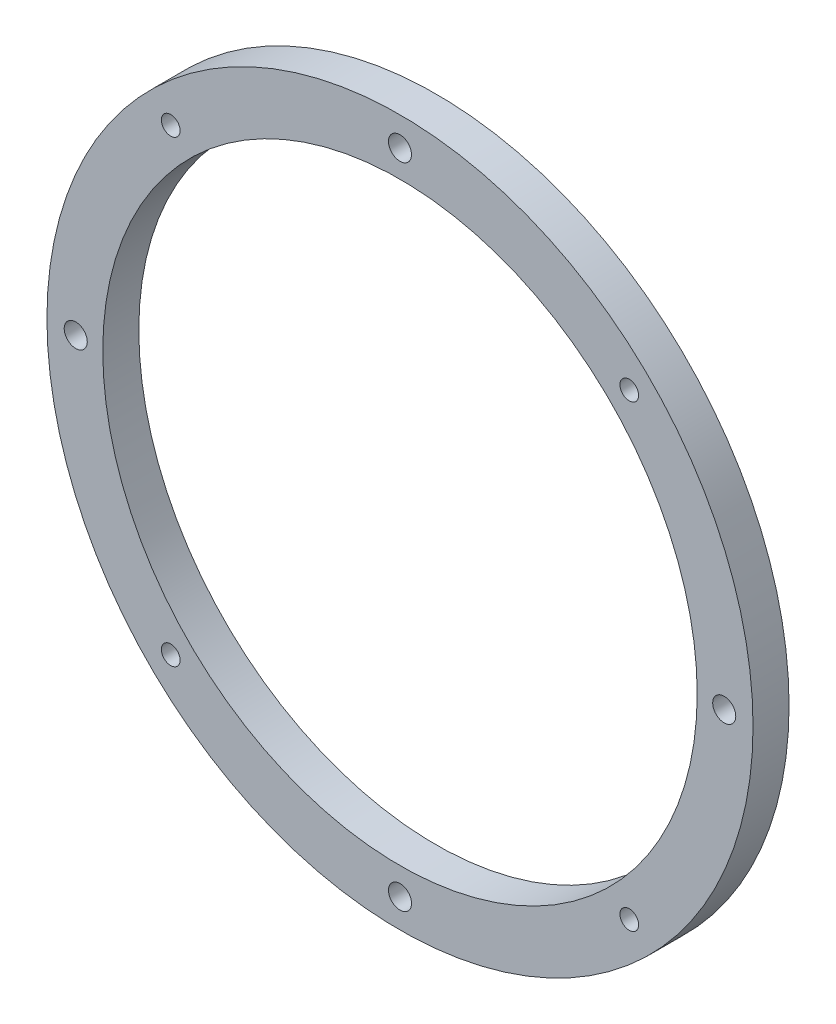
ISO-10303-21;
HEADER;
FILE_DESCRIPTION(('STEP AP214'),'2;1');
FILE_NAME('part.step','',(''),(''),'','','');
FILE_SCHEMA(('AUTOMOTIVE_DESIGN { 1 0 10303 214 1 1 1 1 }'));
ENDSEC;
DATA;
#1=APPLICATION_CONTEXT('core data for automotive mechanical design processes');
#2=APPLICATION_PROTOCOL_DEFINITION('international standard','automotive_design',2000,#1);
#3=PRODUCT_CONTEXT('',#1,'mechanical');
#4=PRODUCT('Part','Part','',(#3));
#5=PRODUCT_RELATED_PRODUCT_CATEGORY('part','',(#4));
#6=PRODUCT_DEFINITION_FORMATION('','',#4);
#7=PRODUCT_DEFINITION_CONTEXT('part definition',#1,'design');
#8=PRODUCT_DEFINITION('design','',#6,#7);
#9=PRODUCT_DEFINITION_SHAPE('','',#8);
#10=(LENGTH_UNIT() NAMED_UNIT(*) SI_UNIT(.MILLI.,.METRE.));
#11=(NAMED_UNIT(*) PLANE_ANGLE_UNIT() SI_UNIT($,.RADIAN.));
#12=(NAMED_UNIT(*) SI_UNIT($,.STERADIAN.) SOLID_ANGLE_UNIT());
#13=UNCERTAINTY_MEASURE_WITH_UNIT(LENGTH_MEASURE(1.E-05),#10,'distance_accuracy_value','');
#14=(GEOMETRIC_REPRESENTATION_CONTEXT(3) GLOBAL_UNCERTAINTY_ASSIGNED_CONTEXT((#13)) GLOBAL_UNIT_ASSIGNED_CONTEXT((#10,
#11,#12)) REPRESENTATION_CONTEXT('',''));
#15=CARTESIAN_POINT('',(0.,0.,0.));
#16=DIRECTION('',(0.,0.,1.));
#17=DIRECTION('',(1.,0.,0.));
#18=AXIS2_PLACEMENT_3D('',#15,#16,#17);
#19=CARTESIAN_POINT('',(0.,0.,127.));
#20=DIRECTION('',(0.,0.,1.));
#21=DIRECTION('',(1.,0.,0.));
#22=AXIS2_PLACEMENT_3D('',#19,#20,#21);
#23=PLANE('',#22);
#24=CARTESIAN_POINT('',(-1143.,-5.08348353050441E-13,127.));
#25=DIRECTION('',(0.,0.,1.));
#26=DIRECTION('',(1.,0.,0.));
#27=AXIS2_PLACEMENT_3D('',#24,#25,#26);
#28=CIRCLE('',#27,40.6400000000121);
#29=CARTESIAN_POINT('',(-1102.35999999999,-5.08348353050441E-13,127.));
#30=VERTEX_POINT('',#29);
#31=EDGE_CURVE('E98',#30,#30,#28,.T.);
#32=ORIENTED_EDGE('',*,*,#31,.F.);
#33=EDGE_LOOP('',(#32));
#34=FACE_BOUND('',#33,.T.);
#35=CARTESIAN_POINT('',(1.29665096438356E-12,-1143.,127.));
#36=DIRECTION('',(0.,0.,1.));
#37=DIRECTION('',(1.,0.,0.));
#38=AXIS2_PLACEMENT_3D('',#35,#36,#37);
#39=CIRCLE('',#38,40.6400000000089);
#40=CARTESIAN_POINT('',(40.6400000000102,-1143.,127.));
#41=VERTEX_POINT('',#40);
#42=EDGE_CURVE('E86',#41,#41,#39,.T.);
#43=ORIENTED_EDGE('',*,*,#42,.F.);
#44=EDGE_LOOP('',(#43));
#45=FACE_BOUND('',#44,.T.);
#46=CARTESIAN_POINT('',(1143.,6.4832548219056E-13,127.));
#47=DIRECTION('',(0.,0.,1.));
#48=DIRECTION('',(1.,0.,0.));
#49=AXIS2_PLACEMENT_3D('',#46,#47,#48);
#50=CIRCLE('',#49,40.6400000000042);
#51=CARTESIAN_POINT('',(1183.64,6.4832548219056E-13,127.));
#52=VERTEX_POINT('',#51);
#53=EDGE_CURVE('E74',#52,#52,#50,.T.);
#54=ORIENTED_EDGE('',*,*,#53,.F.);
#55=EDGE_LOOP('',(#54));
#56=FACE_BOUND('',#55,.T.);
#57=CARTESIAN_POINT('',(0.,1143.,127.));
#58=DIRECTION('',(0.,0.,1.));
#59=DIRECTION('',(1.,0.,0.));
#60=AXIS2_PLACEMENT_3D('',#57,#58,#59);
#61=CIRCLE('',#60,40.64);
#62=CARTESIAN_POINT('',(40.64,1143.,127.));
#63=VERTEX_POINT('',#62);
#64=EDGE_CURVE('E62',#63,#63,#61,.T.);
#65=ORIENTED_EDGE('',*,*,#64,.F.);
#66=EDGE_LOOP('',(#65));
#67=FACE_BOUND('',#66,.T.);
#68=CARTESIAN_POINT('',(0.,0.,127.));
#69=DIRECTION('',(0.,0.,1.));
#70=DIRECTION('',(1.,0.,0.));
#71=AXIS2_PLACEMENT_3D('',#68,#69,#70);
#72=CIRCLE('',#71,1244.6);
#73=CARTESIAN_POINT('',(1244.6,0.,127.));
#74=VERTEX_POINT('',#73);
#75=EDGE_CURVE('E10',#74,#74,#72,.T.);
#76=ORIENTED_EDGE('',*,*,#75,.T.);
#77=EDGE_LOOP('',(#76));
#78=FACE_BOUND('',#77,.T.);
#79=CARTESIAN_POINT('',(0.,0.,127.));
#80=DIRECTION('',(0.,0.,1.));
#81=DIRECTION('',(1.,0.,0.));
#82=AXIS2_PLACEMENT_3D('',#79,#80,#81);
#83=CIRCLE('',#82,1047.78302);
#84=CARTESIAN_POINT('',(1047.78302,0.,127.));
#85=VERTEX_POINT('',#84);
#86=EDGE_CURVE('E57',#85,#85,#83,.T.);
#87=ORIENTED_EDGE('',*,*,#86,.F.);
#88=EDGE_LOOP('',(#87));
#89=FACE_BOUND('',#88,.T.);
#90=CARTESIAN_POINT('',(808.223050896225,808.223050896223,127.));
#91=DIRECTION('',(0.,0.,1.));
#92=DIRECTION('',(1.,0.,0.));
#93=AXIS2_PLACEMENT_3D('',#90,#91,#92);
#94=CIRCLE('',#93,33.0199999999999);
#95=CARTESIAN_POINT('',(841.243050896225,808.223050896223,127.));
#96=VERTEX_POINT('',#95);
#97=EDGE_CURVE('E68',#96,#96,#94,.T.);
#98=ORIENTED_EDGE('',*,*,#97,.F.);
#99=EDGE_LOOP('',(#98));
#100=FACE_BOUND('',#99,.T.);
#101=CARTESIAN_POINT('',(808.223050896223,-808.223050896225,127.));
#102=DIRECTION('',(0.,0.,1.));
#103=DIRECTION('',(1.,0.,0.));
#104=AXIS2_PLACEMENT_3D('',#101,#102,#103);
#105=CIRCLE('',#104,33.0200000000019);
#106=CARTESIAN_POINT('',(841.243050896225,-808.223050896225,127.));
#107=VERTEX_POINT('',#106);
#108=EDGE_CURVE('E80',#107,#107,#105,.T.);
#109=ORIENTED_EDGE('',*,*,#108,.F.);
#110=EDGE_LOOP('',(#109));
#111=FACE_BOUND('',#110,.T.);
#112=CARTESIAN_POINT('',(-808.223050896224,-808.223050896223,127.));
#113=DIRECTION('',(0.,0.,1.));
#114=DIRECTION('',(1.,0.,0.));
#115=AXIS2_PLACEMENT_3D('',#112,#113,#114);
#116=CIRCLE('',#115,33.0200000000044);
#117=CARTESIAN_POINT('',(-775.20305089622,-808.223050896223,127.));
#118=VERTEX_POINT('',#117);
#119=EDGE_CURVE('E92',#118,#118,#116,.T.);
#120=ORIENTED_EDGE('',*,*,#119,.F.);
#121=EDGE_LOOP('',(#120));
#122=FACE_BOUND('',#121,.T.);
#123=CARTESIAN_POINT('',(-808.223050896222,808.223050896225,127.));
#124=DIRECTION('',(0.,0.,1.));
#125=DIRECTION('',(1.,0.,0.));
#126=AXIS2_PLACEMENT_3D('',#123,#124,#125);
#127=CIRCLE('',#126,33.0200000000058);
#128=CARTESIAN_POINT('',(-775.203050896216,808.223050896225,127.));
#129=VERTEX_POINT('',#128);
#130=EDGE_CURVE('E104',#129,#129,#127,.T.);
#131=ORIENTED_EDGE('',*,*,#130,.F.);
#132=EDGE_LOOP('',(#131));
#133=FACE_BOUND('',#132,.T.);
#134=ADVANCED_FACE('F46',(#34,#45,#56,#67,#78,#89,#100,#111,#122,#133),#23,.T.);
#135=CARTESIAN_POINT('',(0.,0.,0.));
#136=DIRECTION('',(0.,0.,1.));
#137=DIRECTION('',(1.,0.,0.));
#138=AXIS2_PLACEMENT_3D('',#135,#136,#137);
#139=PLANE('',#138);
#140=CARTESIAN_POINT('',(0.,0.,0.));
#141=DIRECTION('',(0.,0.,1.));
#142=DIRECTION('',(1.,0.,0.));
#143=AXIS2_PLACEMENT_3D('',#140,#141,#142);
#144=CIRCLE('',#143,1244.6);
#145=CARTESIAN_POINT('',(1244.6,0.,0.));
#146=VERTEX_POINT('',#145);
#147=EDGE_CURVE('E50',#146,#146,#144,.T.);
#148=ORIENTED_EDGE('',*,*,#147,.F.);
#149=EDGE_LOOP('',(#148));
#150=FACE_BOUND('',#149,.T.);
#151=CARTESIAN_POINT('',(0.,0.,0.));
#152=DIRECTION('',(0.,0.,1.));
#153=DIRECTION('',(1.,0.,0.));
#154=AXIS2_PLACEMENT_3D('',#151,#152,#153);
#155=CIRCLE('',#154,1047.78302);
#156=CARTESIAN_POINT('',(1047.78302,0.,0.));
#157=VERTEX_POINT('',#156);
#158=EDGE_CURVE('E59',#157,#157,#155,.T.);
#159=ORIENTED_EDGE('',*,*,#158,.T.);
#160=EDGE_LOOP('',(#159));
#161=FACE_BOUND('',#160,.T.);
#162=CARTESIAN_POINT('',(0.,1143.,0.));
#163=DIRECTION('',(0.,0.,1.));
#164=DIRECTION('',(1.,0.,0.));
#165=AXIS2_PLACEMENT_3D('',#162,#163,#164);
#166=CIRCLE('',#165,40.64);
#167=CARTESIAN_POINT('',(40.64,1143.,0.));
#168=VERTEX_POINT('',#167);
#169=EDGE_CURVE('E65',#168,#168,#166,.T.);
#170=ORIENTED_EDGE('',*,*,#169,.T.);
#171=EDGE_LOOP('',(#170));
#172=FACE_BOUND('',#171,.T.);
#173=CARTESIAN_POINT('',(808.223050896225,808.223050896223,0.));
#174=DIRECTION('',(0.,0.,1.));
#175=DIRECTION('',(1.,0.,0.));
#176=AXIS2_PLACEMENT_3D('',#173,#174,#175);
#177=CIRCLE('',#176,33.0199999999999);
#178=CARTESIAN_POINT('',(841.243050896225,808.223050896223,0.));
#179=VERTEX_POINT('',#178);
#180=EDGE_CURVE('E71',#179,#179,#177,.T.);
#181=ORIENTED_EDGE('',*,*,#180,.T.);
#182=EDGE_LOOP('',(#181));
#183=FACE_BOUND('',#182,.T.);
#184=CARTESIAN_POINT('',(1143.,6.4832548219056E-13,0.));
#185=DIRECTION('',(0.,0.,1.));
#186=DIRECTION('',(1.,0.,0.));
#187=AXIS2_PLACEMENT_3D('',#184,#185,#186);
#188=CIRCLE('',#187,40.6400000000042);
#189=CARTESIAN_POINT('',(1183.64,6.4832548219056E-13,0.));
#190=VERTEX_POINT('',#189);
#191=EDGE_CURVE('E77',#190,#190,#188,.T.);
#192=ORIENTED_EDGE('',*,*,#191,.T.);
#193=EDGE_LOOP('',(#192));
#194=FACE_BOUND('',#193,.T.);
#195=CARTESIAN_POINT('',(808.223050896223,-808.223050896225,0.));
#196=DIRECTION('',(0.,0.,1.));
#197=DIRECTION('',(1.,0.,0.));
#198=AXIS2_PLACEMENT_3D('',#195,#196,#197);
#199=CIRCLE('',#198,33.0200000000019);
#200=CARTESIAN_POINT('',(841.243050896225,-808.223050896225,0.));
#201=VERTEX_POINT('',#200);
#202=EDGE_CURVE('E83',#201,#201,#199,.T.);
#203=ORIENTED_EDGE('',*,*,#202,.T.);
#204=EDGE_LOOP('',(#203));
#205=FACE_BOUND('',#204,.T.);
#206=CARTESIAN_POINT('',(1.29665096438356E-12,-1143.,0.));
#207=DIRECTION('',(0.,0.,1.));
#208=DIRECTION('',(1.,0.,0.));
#209=AXIS2_PLACEMENT_3D('',#206,#207,#208);
#210=CIRCLE('',#209,40.6400000000089);
#211=CARTESIAN_POINT('',(40.6400000000102,-1143.,0.));
#212=VERTEX_POINT('',#211);
#213=EDGE_CURVE('E89',#212,#212,#210,.T.);
#214=ORIENTED_EDGE('',*,*,#213,.T.);
#215=EDGE_LOOP('',(#214));
#216=FACE_BOUND('',#215,.T.);
#217=CARTESIAN_POINT('',(-808.223050896224,-808.223050896223,0.));
#218=DIRECTION('',(0.,0.,1.));
#219=DIRECTION('',(1.,0.,0.));
#220=AXIS2_PLACEMENT_3D('',#217,#218,#219);
#221=CIRCLE('',#220,33.0200000000044);
#222=CARTESIAN_POINT('',(-775.20305089622,-808.223050896223,0.));
#223=VERTEX_POINT('',#222);
#224=EDGE_CURVE('E95',#223,#223,#221,.T.);
#225=ORIENTED_EDGE('',*,*,#224,.T.);
#226=EDGE_LOOP('',(#225));
#227=FACE_BOUND('',#226,.T.);
#228=CARTESIAN_POINT('',(-1143.,-5.08348353050441E-13,0.));
#229=DIRECTION('',(0.,0.,1.));
#230=DIRECTION('',(1.,0.,0.));
#231=AXIS2_PLACEMENT_3D('',#228,#229,#230);
#232=CIRCLE('',#231,40.6400000000121);
#233=CARTESIAN_POINT('',(-1102.35999999999,-5.08348353050441E-13,0.));
#234=VERTEX_POINT('',#233);
#235=EDGE_CURVE('E101',#234,#234,#232,.T.);
#236=ORIENTED_EDGE('',*,*,#235,.T.);
#237=EDGE_LOOP('',(#236));
#238=FACE_BOUND('',#237,.T.);
#239=CARTESIAN_POINT('',(-808.223050896222,808.223050896225,0.));
#240=DIRECTION('',(0.,0.,1.));
#241=DIRECTION('',(1.,0.,0.));
#242=AXIS2_PLACEMENT_3D('',#239,#240,#241);
#243=CIRCLE('',#242,33.0200000000058);
#244=CARTESIAN_POINT('',(-775.203050896216,808.223050896225,0.));
#245=VERTEX_POINT('',#244);
#246=EDGE_CURVE('E107',#245,#245,#243,.T.);
#247=ORIENTED_EDGE('',*,*,#246,.T.);
#248=EDGE_LOOP('',(#247));
#249=FACE_BOUND('',#248,.T.);
#250=ADVANCED_FACE('F117',(#150,#161,#172,#183,#194,#205,#216,#227,#238,#249),#139,.F.);
#251=CARTESIAN_POINT('',(0.,0.,127.));
#252=DIRECTION('',(0.,0.,-1.));
#253=DIRECTION('',(-1.,0.,0.));
#254=AXIS2_PLACEMENT_3D('',#251,#252,#253);
#255=CYLINDRICAL_SURFACE('',#254,1244.6);
#256=ORIENTED_EDGE('',*,*,#75,.F.);
#257=EDGE_LOOP('',(#256));
#258=FACE_BOUND('',#257,.T.);
#259=ORIENTED_EDGE('',*,*,#147,.T.);
#260=EDGE_LOOP('',(#259));
#261=FACE_BOUND('',#260,.T.);
#262=ADVANCED_FACE('F48',(#258,#261),#255,.T.);
#263=CARTESIAN_POINT('',(0.,0.,127.));
#264=DIRECTION('',(0.,0.,-1.));
#265=DIRECTION('',(-1.,0.,0.));
#266=AXIS2_PLACEMENT_3D('',#263,#264,#265);
#267=CYLINDRICAL_SURFACE('',#266,1047.78302);
#268=ORIENTED_EDGE('',*,*,#86,.T.);
#269=EDGE_LOOP('',(#268));
#270=FACE_BOUND('',#269,.T.);
#271=ORIENTED_EDGE('',*,*,#158,.F.);
#272=EDGE_LOOP('',(#271));
#273=FACE_BOUND('',#272,.T.);
#274=ADVANCED_FACE('F128',(#270,#273),#267,.F.);
#275=CARTESIAN_POINT('',(0.,1143.,127.));
#276=DIRECTION('',(0.,0.,-1.));
#277=DIRECTION('',(-1.,0.,0.));
#278=AXIS2_PLACEMENT_3D('',#275,#276,#277);
#279=CYLINDRICAL_SURFACE('',#278,40.64);
#280=ORIENTED_EDGE('',*,*,#64,.T.);
#281=EDGE_LOOP('',(#280));
#282=FACE_BOUND('',#281,.T.);
#283=ORIENTED_EDGE('',*,*,#169,.F.);
#284=EDGE_LOOP('',(#283));
#285=FACE_BOUND('',#284,.T.);
#286=ADVANCED_FACE('F131',(#282,#285),#279,.F.);
#287=CARTESIAN_POINT('',(808.223050896225,808.223050896223,127.));
#288=DIRECTION('',(0.,0.,-1.));
#289=DIRECTION('',(-1.,0.,0.));
#290=AXIS2_PLACEMENT_3D('',#287,#288,#289);
#291=CYLINDRICAL_SURFACE('',#290,33.0199999999999);
#292=ORIENTED_EDGE('',*,*,#97,.T.);
#293=EDGE_LOOP('',(#292));
#294=FACE_BOUND('',#293,.T.);
#295=ORIENTED_EDGE('',*,*,#180,.F.);
#296=EDGE_LOOP('',(#295));
#297=FACE_BOUND('',#296,.T.);
#298=ADVANCED_FACE('F135',(#294,#297),#291,.F.);
#299=CARTESIAN_POINT('',(1143.,6.4832548219056E-13,127.));
#300=DIRECTION('',(0.,0.,-1.));
#301=DIRECTION('',(-1.,0.,0.));
#302=AXIS2_PLACEMENT_3D('',#299,#300,#301);
#303=CYLINDRICAL_SURFACE('',#302,40.6400000000042);
#304=ORIENTED_EDGE('',*,*,#53,.T.);
#305=EDGE_LOOP('',(#304));
#306=FACE_BOUND('',#305,.T.);
#307=ORIENTED_EDGE('',*,*,#191,.F.);
#308=EDGE_LOOP('',(#307));
#309=FACE_BOUND('',#308,.T.);
#310=ADVANCED_FACE('F139',(#306,#309),#303,.F.);
#311=CARTESIAN_POINT('',(808.223050896223,-808.223050896225,127.));
#312=DIRECTION('',(0.,0.,-1.));
#313=DIRECTION('',(-1.,0.,0.));
#314=AXIS2_PLACEMENT_3D('',#311,#312,#313);
#315=CYLINDRICAL_SURFACE('',#314,33.0200000000019);
#316=ORIENTED_EDGE('',*,*,#108,.T.);
#317=EDGE_LOOP('',(#316));
#318=FACE_BOUND('',#317,.T.);
#319=ORIENTED_EDGE('',*,*,#202,.F.);
#320=EDGE_LOOP('',(#319));
#321=FACE_BOUND('',#320,.T.);
#322=ADVANCED_FACE('F143',(#318,#321),#315,.F.);
#323=CARTESIAN_POINT('',(1.29665096438356E-12,-1143.,127.));
#324=DIRECTION('',(0.,0.,-1.));
#325=DIRECTION('',(-1.,0.,0.));
#326=AXIS2_PLACEMENT_3D('',#323,#324,#325);
#327=CYLINDRICAL_SURFACE('',#326,40.6400000000089);
#328=ORIENTED_EDGE('',*,*,#42,.T.);
#329=EDGE_LOOP('',(#328));
#330=FACE_BOUND('',#329,.T.);
#331=ORIENTED_EDGE('',*,*,#213,.F.);
#332=EDGE_LOOP('',(#331));
#333=FACE_BOUND('',#332,.T.);
#334=ADVANCED_FACE('F147',(#330,#333),#327,.F.);
#335=CARTESIAN_POINT('',(-808.223050896224,-808.223050896223,127.));
#336=DIRECTION('',(0.,0.,-1.));
#337=DIRECTION('',(-1.,0.,0.));
#338=AXIS2_PLACEMENT_3D('',#335,#336,#337);
#339=CYLINDRICAL_SURFACE('',#338,33.0200000000044);
#340=ORIENTED_EDGE('',*,*,#119,.T.);
#341=EDGE_LOOP('',(#340));
#342=FACE_BOUND('',#341,.T.);
#343=ORIENTED_EDGE('',*,*,#224,.F.);
#344=EDGE_LOOP('',(#343));
#345=FACE_BOUND('',#344,.T.);
#346=ADVANCED_FACE('F151',(#342,#345),#339,.F.);
#347=CARTESIAN_POINT('',(-1143.,-5.08348353050441E-13,127.));
#348=DIRECTION('',(0.,0.,-1.));
#349=DIRECTION('',(-1.,0.,0.));
#350=AXIS2_PLACEMENT_3D('',#347,#348,#349);
#351=CYLINDRICAL_SURFACE('',#350,40.6400000000121);
#352=ORIENTED_EDGE('',*,*,#31,.T.);
#353=EDGE_LOOP('',(#352));
#354=FACE_BOUND('',#353,.T.);
#355=ORIENTED_EDGE('',*,*,#235,.F.);
#356=EDGE_LOOP('',(#355));
#357=FACE_BOUND('',#356,.T.);
#358=ADVANCED_FACE('F155',(#354,#357),#351,.F.);
#359=CARTESIAN_POINT('',(-808.223050896222,808.223050896225,127.));
#360=DIRECTION('',(0.,0.,-1.));
#361=DIRECTION('',(-1.,0.,0.));
#362=AXIS2_PLACEMENT_3D('',#359,#360,#361);
#363=CYLINDRICAL_SURFACE('',#362,33.0200000000058);
#364=ORIENTED_EDGE('',*,*,#130,.T.);
#365=EDGE_LOOP('',(#364));
#366=FACE_BOUND('',#365,.T.);
#367=ORIENTED_EDGE('',*,*,#246,.F.);
#368=EDGE_LOOP('',(#367));
#369=FACE_BOUND('',#368,.T.);
#370=ADVANCED_FACE('F113',(#366,#369),#363,.F.);
#371=CLOSED_SHELL('',(#134,#250,#262,#274,#286,#298,#310,#322,#334,#346,#358,#370));
#372=MANIFOLD_SOLID_BREP('B2',#371);
#373=ADVANCED_BREP_SHAPE_REPRESENTATION('',(#18,#372),#14);
#374=SHAPE_DEFINITION_REPRESENTATION(#9,#373);
ENDSEC;
END-ISO-10303-21;
